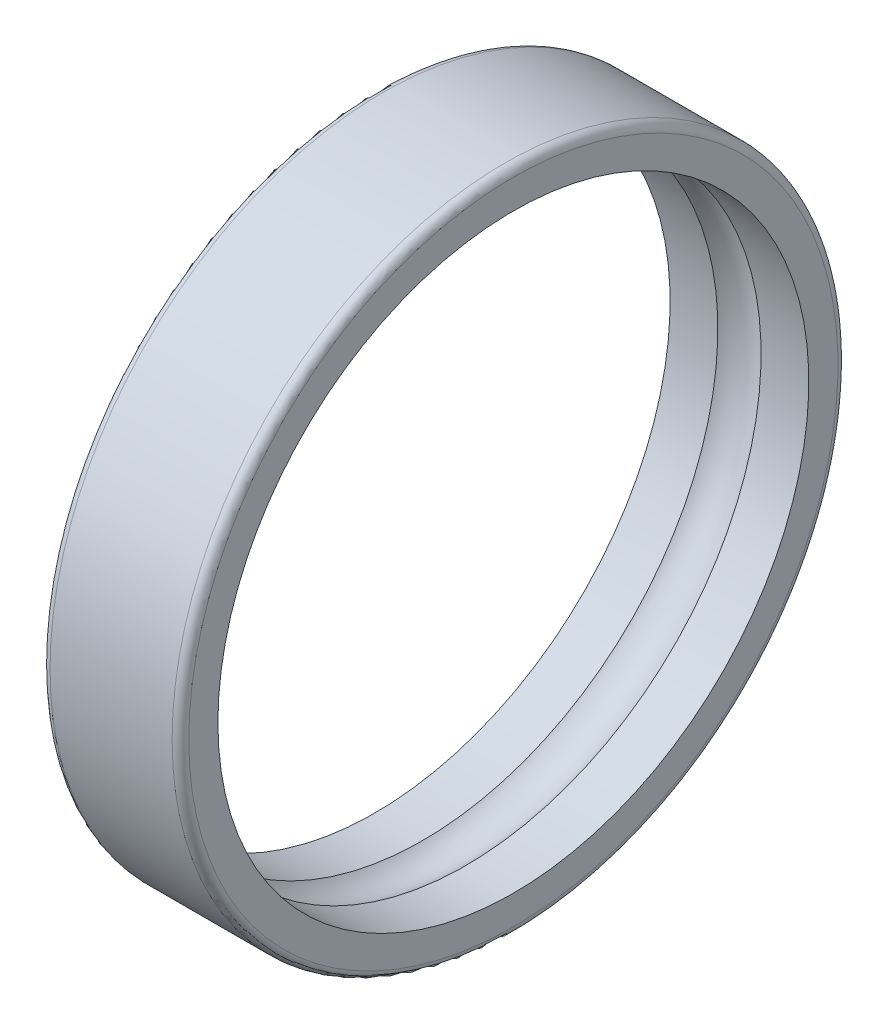
ISO-10303-21;
HEADER;
FILE_DESCRIPTION(('STEP AP214'),'2;1');
FILE_NAME('part.step','',(''),(''),'','','');
FILE_SCHEMA(('AUTOMOTIVE_DESIGN { 1 0 10303 214 1 1 1 1 }'));
ENDSEC;
DATA;
#1=APPLICATION_CONTEXT('core data for automotive mechanical design processes');
#2=APPLICATION_PROTOCOL_DEFINITION('international standard','automotive_design',2000,#1);
#3=PRODUCT_CONTEXT('',#1,'mechanical');
#4=PRODUCT('Part','Part','',(#3));
#5=PRODUCT_RELATED_PRODUCT_CATEGORY('part','',(#4));
#6=PRODUCT_DEFINITION_FORMATION('','',#4);
#7=PRODUCT_DEFINITION_CONTEXT('part definition',#1,'design');
#8=PRODUCT_DEFINITION('design','',#6,#7);
#9=PRODUCT_DEFINITION_SHAPE('','',#8);
#10=(LENGTH_UNIT() NAMED_UNIT(*) SI_UNIT(.MILLI.,.METRE.));
#11=(NAMED_UNIT(*) PLANE_ANGLE_UNIT() SI_UNIT($,.RADIAN.));
#12=(NAMED_UNIT(*) SI_UNIT($,.STERADIAN.) SOLID_ANGLE_UNIT());
#13=UNCERTAINTY_MEASURE_WITH_UNIT(LENGTH_MEASURE(1.E-05),#10,'distance_accuracy_value','');
#14=(GEOMETRIC_REPRESENTATION_CONTEXT(3) GLOBAL_UNCERTAINTY_ASSIGNED_CONTEXT((#13)) GLOBAL_UNIT_ASSIGNED_CONTEXT((#10,
#11,#12)) REPRESENTATION_CONTEXT('',''));
#15=CARTESIAN_POINT('',(0.,0.,0.));
#16=DIRECTION('',(0.,0.,1.));
#17=DIRECTION('',(1.,0.,0.));
#18=AXIS2_PLACEMENT_3D('',#15,#16,#17);
#19=CARTESIAN_POINT('',(0.299999999999942,0.,0.));
#20=DIRECTION('',(-1.,0.,0.));
#21=DIRECTION('',(0.,0.,1.));
#22=AXIS2_PLACEMENT_3D('',#19,#20,#21);
#23=TOROIDAL_SURFACE('',#22,11.7000000000001,0.299999999999942);
#24=CARTESIAN_POINT('',(0.,0.,0.));
#25=DIRECTION('',(-1.,0.,0.));
#26=DIRECTION('',(0.,0.,1.));
#27=AXIS2_PLACEMENT_3D('',#24,#25,#26);
#28=CIRCLE('',#27,11.7);
#29=CARTESIAN_POINT('',(0.,0.,11.7));
#30=VERTEX_POINT('',#29);
#31=EDGE_CURVE('E10',#30,#30,#28,.T.);
#32=ORIENTED_EDGE('',*,*,#31,.F.);
#33=EDGE_LOOP('',(#32));
#34=FACE_BOUND('',#33,.T.);
#35=CARTESIAN_POINT('',(0.299999999999995,0.,0.));
#36=DIRECTION('',(-1.,0.,0.));
#37=DIRECTION('',(0.,0.,1.));
#38=AXIS2_PLACEMENT_3D('',#35,#36,#37);
#39=CIRCLE('',#38,12.);
#40=CARTESIAN_POINT('',(0.299999999999995,0.,12.));
#41=VERTEX_POINT('',#40);
#42=EDGE_CURVE('E63',#41,#41,#39,.T.);
#43=ORIENTED_EDGE('',*,*,#42,.T.);
#44=EDGE_LOOP('',(#43));
#45=FACE_BOUND('',#44,.T.);
#46=ADVANCED_FACE('F35',(#34,#45),#23,.T.);
#47=CARTESIAN_POINT('',(0.,11.7,0.));
#48=DIRECTION('',(1.,0.,0.));
#49=DIRECTION('',(0.,0.,-1.));
#50=AXIS2_PLACEMENT_3D('',#47,#48,#49);
#51=PLANE('',#50);
#52=CARTESIAN_POINT('',(0.,0.,0.));
#53=DIRECTION('',(-1.,0.,0.));
#54=DIRECTION('',(0.,0.,1.));
#55=AXIS2_PLACEMENT_3D('',#52,#53,#54);
#56=CIRCLE('',#55,10.65);
#57=CARTESIAN_POINT('',(0.,0.,10.65));
#58=VERTEX_POINT('',#57);
#59=EDGE_CURVE('E41',#58,#58,#56,.T.);
#60=ORIENTED_EDGE('',*,*,#59,.F.);
#61=EDGE_LOOP('',(#60));
#62=FACE_BOUND('',#61,.T.);
#63=ORIENTED_EDGE('',*,*,#31,.T.);
#64=EDGE_LOOP('',(#63));
#65=FACE_BOUND('',#64,.T.);
#66=ADVANCED_FACE('F100',(#62,#65),#51,.F.);
#67=CARTESIAN_POINT('',(200.,0.,0.));
#68=DIRECTION('',(-1.,0.,0.));
#69=DIRECTION('',(0.,0.,1.));
#70=AXIS2_PLACEMENT_3D('',#67,#68,#69);
#71=CYLINDRICAL_SURFACE('',#70,10.65);
#72=CARTESIAN_POINT('',(1.72071170289809,0.,0.));
#73=DIRECTION('',(-1.,0.,0.));
#74=DIRECTION('',(0.,0.,1.));
#75=AXIS2_PLACEMENT_3D('',#72,#73,#74);
#76=CIRCLE('',#75,10.65);
#77=CARTESIAN_POINT('',(1.72071170289809,0.,10.65));
#78=VERTEX_POINT('',#77);
#79=EDGE_CURVE('E45',#78,#78,#76,.T.);
#80=ORIENTED_EDGE('',*,*,#79,.F.);
#81=EDGE_LOOP('',(#80));
#82=FACE_BOUND('',#81,.T.);
#83=ORIENTED_EDGE('',*,*,#59,.T.);
#84=EDGE_LOOP('',(#83));
#85=FACE_BOUND('',#84,.T.);
#86=ADVANCED_FACE('F95',(#82,#85),#71,.F.);
#87=CARTESIAN_POINT('',(2.5,0.,0.));
#88=DIRECTION('',(-1.,0.,0.));
#89=DIRECTION('',(0.,0.,1.));
#90=AXIS2_PLACEMENT_3D('',#87,#88,#89);
#91=TOROIDAL_SURFACE('',#90,9.75000000000003,1.19049999999997);
#92=CARTESIAN_POINT('',(3.27928829710189,0.,0.));
#93=DIRECTION('',(-1.,0.,0.));
#94=DIRECTION('',(0.,0.,1.));
#95=AXIS2_PLACEMENT_3D('',#92,#93,#94);
#96=CIRCLE('',#95,10.65);
#97=CARTESIAN_POINT('',(3.27928829710189,0.,10.65));
#98=VERTEX_POINT('',#97);
#99=EDGE_CURVE('E49',#98,#98,#96,.T.);
#100=ORIENTED_EDGE('',*,*,#99,.F.);
#101=EDGE_LOOP('',(#100));
#102=FACE_BOUND('',#101,.T.);
#103=ORIENTED_EDGE('',*,*,#79,.T.);
#104=EDGE_LOOP('',(#103));
#105=FACE_BOUND('',#104,.T.);
#106=ADVANCED_FACE('F89',(#102,#105),#91,.F.);
#107=CARTESIAN_POINT('',(200.,0.,0.));
#108=DIRECTION('',(-1.,0.,0.));
#109=DIRECTION('',(0.,0.,1.));
#110=AXIS2_PLACEMENT_3D('',#107,#108,#109);
#111=CYLINDRICAL_SURFACE('',#110,10.65);
#112=CARTESIAN_POINT('',(5.,0.,0.));
#113=DIRECTION('',(-1.,0.,0.));
#114=DIRECTION('',(0.,0.,1.));
#115=AXIS2_PLACEMENT_3D('',#112,#113,#114);
#116=CIRCLE('',#115,10.65);
#117=CARTESIAN_POINT('',(5.,0.,10.65));
#118=VERTEX_POINT('',#117);
#119=EDGE_CURVE('E54',#118,#118,#116,.T.);
#120=ORIENTED_EDGE('',*,*,#119,.F.);
#121=EDGE_LOOP('',(#120));
#122=FACE_BOUND('',#121,.T.);
#123=ORIENTED_EDGE('',*,*,#99,.T.);
#124=EDGE_LOOP('',(#123));
#125=FACE_BOUND('',#124,.T.);
#126=ADVANCED_FACE('F83',(#122,#125),#111,.F.);
#127=CARTESIAN_POINT('',(5.,10.65,0.));
#128=DIRECTION('',(-1.,0.,0.));
#129=DIRECTION('',(0.,0.,1.));
#130=AXIS2_PLACEMENT_3D('',#127,#128,#129);
#131=PLANE('',#130);
#132=CARTESIAN_POINT('',(5.,0.,0.));
#133=DIRECTION('',(-1.,0.,0.));
#134=DIRECTION('',(0.,0.,1.));
#135=AXIS2_PLACEMENT_3D('',#132,#133,#134);
#136=CIRCLE('',#135,11.7);
#137=CARTESIAN_POINT('',(5.,0.,11.7));
#138=VERTEX_POINT('',#137);
#139=EDGE_CURVE('E57',#138,#138,#136,.T.);
#140=ORIENTED_EDGE('',*,*,#139,.F.);
#141=EDGE_LOOP('',(#140));
#142=FACE_BOUND('',#141,.T.);
#143=ORIENTED_EDGE('',*,*,#119,.T.);
#144=EDGE_LOOP('',(#143));
#145=FACE_BOUND('',#144,.T.);
#146=ADVANCED_FACE('F77',(#142,#145),#131,.F.);
#147=CARTESIAN_POINT('',(4.70000000000012,0.,0.));
#148=DIRECTION('',(-1.,0.,0.));
#149=DIRECTION('',(0.,0.,1.));
#150=AXIS2_PLACEMENT_3D('',#147,#148,#149);
#151=TOROIDAL_SURFACE('',#150,11.7000000000001,0.29999999999988);
#152=CARTESIAN_POINT('',(4.70000000000001,0.,0.));
#153=DIRECTION('',(-1.,0.,0.));
#154=DIRECTION('',(0.,0.,1.));
#155=AXIS2_PLACEMENT_3D('',#152,#153,#154);
#156=CIRCLE('',#155,12.);
#157=CARTESIAN_POINT('',(4.70000000000001,0.,12.));
#158=VERTEX_POINT('',#157);
#159=EDGE_CURVE('E60',#158,#158,#156,.T.);
#160=ORIENTED_EDGE('',*,*,#159,.F.);
#161=EDGE_LOOP('',(#160));
#162=FACE_BOUND('',#161,.T.);
#163=ORIENTED_EDGE('',*,*,#139,.T.);
#164=EDGE_LOOP('',(#163));
#165=FACE_BOUND('',#164,.T.);
#166=ADVANCED_FACE('F71',(#162,#165),#151,.T.);
#167=CARTESIAN_POINT('',(200.,0.,0.));
#168=DIRECTION('',(-1.,0.,0.));
#169=DIRECTION('',(0.,0.,1.));
#170=AXIS2_PLACEMENT_3D('',#167,#168,#169);
#171=CYLINDRICAL_SURFACE('',#170,12.);
#172=ORIENTED_EDGE('',*,*,#42,.F.);
#173=EDGE_LOOP('',(#172));
#174=FACE_BOUND('',#173,.T.);
#175=ORIENTED_EDGE('',*,*,#159,.T.);
#176=EDGE_LOOP('',(#175));
#177=FACE_BOUND('',#176,.T.);
#178=ADVANCED_FACE('F68',(#174,#177),#171,.T.);
#179=CLOSED_SHELL('',(#46,#66,#86,#106,#126,#146,#166,#178));
#180=MANIFOLD_SOLID_BREP('B2',#179);
#181=ADVANCED_BREP_SHAPE_REPRESENTATION('',(#18,#180),#14);
#182=SHAPE_DEFINITION_REPRESENTATION(#9,#181);
ENDSEC;
END-ISO-10303-21;
